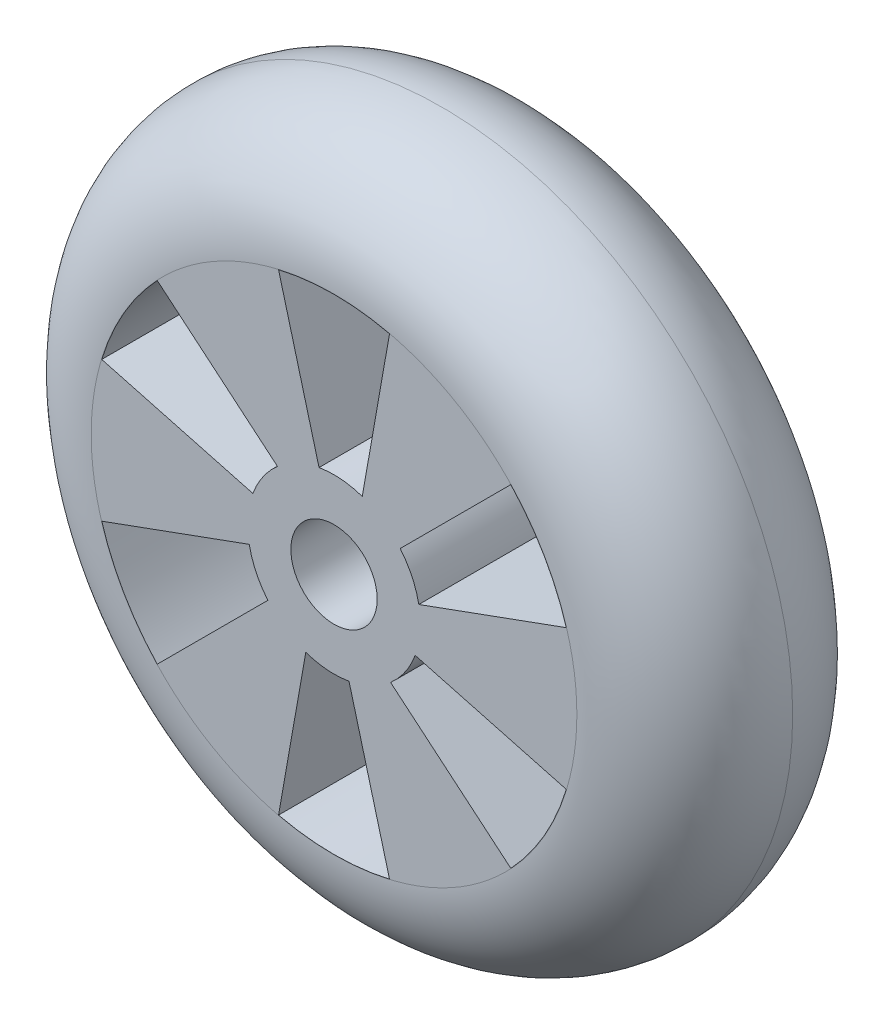
ISO-10303-21;
HEADER;
FILE_DESCRIPTION(('STEP AP214'),'2;1');
FILE_NAME('part.step','',(''),(''),'','','');
FILE_SCHEMA(('AUTOMOTIVE_DESIGN { 1 0 10303 214 1 1 1 1 }'));
ENDSEC;
DATA;
#1=APPLICATION_CONTEXT('core data for automotive mechanical design processes');
#2=APPLICATION_PROTOCOL_DEFINITION('international standard','automotive_design',2000,#1);
#3=PRODUCT_CONTEXT('',#1,'mechanical');
#4=PRODUCT('Part','Part','',(#3));
#5=PRODUCT_RELATED_PRODUCT_CATEGORY('part','',(#4));
#6=PRODUCT_DEFINITION_FORMATION('','',#4);
#7=PRODUCT_DEFINITION_CONTEXT('part definition',#1,'design');
#8=PRODUCT_DEFINITION('design','',#6,#7);
#9=PRODUCT_DEFINITION_SHAPE('','',#8);
#10=(LENGTH_UNIT() NAMED_UNIT(*) SI_UNIT(.MILLI.,.METRE.));
#11=(NAMED_UNIT(*) PLANE_ANGLE_UNIT() SI_UNIT($,.RADIAN.));
#12=(NAMED_UNIT(*) SI_UNIT($,.STERADIAN.) SOLID_ANGLE_UNIT());
#13=UNCERTAINTY_MEASURE_WITH_UNIT(LENGTH_MEASURE(1.E-05),#10,'distance_accuracy_value','');
#14=(GEOMETRIC_REPRESENTATION_CONTEXT(3) GLOBAL_UNCERTAINTY_ASSIGNED_CONTEXT((#13)) GLOBAL_UNIT_ASSIGNED_CONTEXT((#10,
#11,#12)) REPRESENTATION_CONTEXT('',''));
#15=CARTESIAN_POINT('',(0.,0.,0.));
#16=DIRECTION('',(0.,0.,1.));
#17=DIRECTION('',(1.,0.,0.));
#18=AXIS2_PLACEMENT_3D('',#15,#16,#17);
#19=CARTESIAN_POINT('',(0.,0.,20.));
#20=DIRECTION('',(0.,0.,1.));
#21=DIRECTION('',(1.,0.,0.));
#22=AXIS2_PLACEMENT_3D('',#19,#20,#21);
#23=PLANE('',#22);
#24=CARTESIAN_POINT('',(0.,0.,20.));
#25=DIRECTION('',(0.,0.,1.));
#26=DIRECTION('',(0.50000000000001,0.866025403784433,0.));
#27=AXIS2_PLACEMENT_3D('',#24,#25,#26);
#28=CIRCLE('',#27,22.4803729941762);
#29=CARTESIAN_POINT('',(-16.3814038721566,15.3953492046975,20.));
#30=VERTEX_POINT('',#29);
#31=CARTESIAN_POINT('',(-21.5234654474787,6.48903730059213,20.));
#32=VERTEX_POINT('',#31);
#33=EDGE_CURVE('E56',#30,#32,#28,.T.);
#34=ORIENTED_EDGE('',*,*,#33,.F.);
#35=DIRECTION('',(-0.76604444311897,0.642787609686549,0.));
#36=VECTOR('',#35,1.);
#37=CARTESIAN_POINT('',(-16.3814038721566,15.3953492046975,20.));
#38=LINE('',#37,#36);
#39=CARTESIAN_POINT('',(-5.23907942721059,6.04582887248546,20.));
#40=VERTEX_POINT('',#39);
#41=EDGE_CURVE('E370',#40,#30,#38,.T.);
#42=ORIENTED_EDGE('',*,*,#41,.F.);
#43=CARTESIAN_POINT('',(0.,0.,20.));
#44=DIRECTION('',(0.,0.,-1.));
#45=DIRECTION('',(0.50000000000001,0.866025403784433,0.));
#46=AXIS2_PLACEMENT_3D('',#43,#44,#45);
#47=CIRCLE('',#46,8.);
#48=CARTESIAN_POINT('',(-7.51754096628724,2.73616114660543,20.));
#49=VERTEX_POINT('',#48);
#50=EDGE_CURVE('E359',#49,#40,#47,.T.);
#51=ORIENTED_EDGE('',*,*,#50,.F.);
#52=DIRECTION('',(0.965925826289066,-0.258819045102531,0.));
#53=VECTOR('',#52,1.);
#54=CARTESIAN_POINT('',(-21.5234654474787,6.48903730059213,20.));
#55=LINE('',#54,#53);
#56=EDGE_CURVE('E345',#32,#49,#55,.T.);
#57=ORIENTED_EDGE('',*,*,#56,.F.);
#58=EDGE_LOOP('',(#34,#42,#51,#57));
#59=FACE_BOUND('',#58,.T.);
#60=CARTESIAN_POINT('',(0.,0.,20.));
#61=DIRECTION('',(0.,0.,1.));
#62=DIRECTION('',(-0.499999999999992,0.866025403784443,0.));
#63=AXIS2_PLACEMENT_3D('',#60,#61,#62);
#64=CIRCLE('',#63,22.4803729941762);
#65=CARTESIAN_POINT('',(-21.5234654474788,-6.48903730059168,20.));
#66=VERTEX_POINT('',#65);
#67=CARTESIAN_POINT('',(-16.3814038721569,-15.3953492046971,20.));
#68=VERTEX_POINT('',#67);
#69=EDGE_CURVE('E64',#66,#68,#64,.T.);
#70=ORIENTED_EDGE('',*,*,#69,.F.);
#71=DIRECTION('',(-0.939692620785912,-0.342020143325659,0.));
#72=VECTOR('',#71,1.);
#73=CARTESIAN_POINT('',(-21.5234654474788,-6.48903730059168,20.));
#74=LINE('',#73,#72);
#75=CARTESIAN_POINT('',(-7.85538110411112,-1.51426144016609,20.));
#76=VERTEX_POINT('',#75);
#77=EDGE_CURVE('E330',#76,#66,#74,.T.);
#78=ORIENTED_EDGE('',*,*,#77,.F.);
#79=CARTESIAN_POINT('',(0.,0.,20.));
#80=DIRECTION('',(0.,0.,-1.));
#81=DIRECTION('',(-0.499999999999992,0.866025403784443,0.));
#82=AXIS2_PLACEMENT_3D('',#79,#80,#81);
#83=CIRCLE('',#82,8.);
#84=CARTESIAN_POINT('',(-6.12835554495186,-5.14230087749226,20.));
#85=VERTEX_POINT('',#84);
#86=EDGE_CURVE('E319',#85,#76,#83,.T.);
#87=ORIENTED_EDGE('',*,*,#86,.F.);
#88=DIRECTION('',(0.707106781186553,0.707106781186542,0.));
#89=VECTOR('',#88,1.);
#90=CARTESIAN_POINT('',(-16.3814038721569,-15.3953492046971,20.));
#91=LINE('',#90,#89);
#92=EDGE_CURVE('E304',#68,#85,#91,.T.);
#93=ORIENTED_EDGE('',*,*,#92,.F.);
#94=EDGE_LOOP('',(#70,#78,#87,#93));
#95=FACE_BOUND('',#94,.T.);
#96=CARTESIAN_POINT('',(0.,0.,20.));
#97=DIRECTION('',(0.,0.,1.));
#98=DIRECTION('',(-1.,0.,0.));
#99=AXIS2_PLACEMENT_3D('',#96,#97,#98);
#100=CIRCLE('',#99,22.4803729941762);
#101=CARTESIAN_POINT('',(-5.14206157532201,-21.8843865052891,20.));
#102=VERTEX_POINT('',#101);
#103=CARTESIAN_POINT('',(5.14206157532202,-21.8843865052892,20.));
#104=VERTEX_POINT('',#103);
#105=EDGE_CURVE('E298',#102,#104,#100,.T.);
#106=ORIENTED_EDGE('',*,*,#105,.F.);
#107=DIRECTION('',(-0.173648177666931,-0.984807753012208,0.));
#108=VECTOR('',#107,1.);
#109=CARTESIAN_POINT('',(-5.14206157532201,-21.8843865052891,20.));
#110=LINE('',#109,#108);
#111=CARTESIAN_POINT('',(-2.61630167690045,-7.56009031265155,20.));
#112=VERTEX_POINT('',#111);
#113=EDGE_CURVE('E287',#112,#102,#110,.T.);
#114=ORIENTED_EDGE('',*,*,#113,.F.);
#115=CARTESIAN_POINT('',(0.,0.,20.));
#116=DIRECTION('',(0.,0.,-1.));
#117=DIRECTION('',(-1.,0.,0.));
#118=AXIS2_PLACEMENT_3D('',#115,#116,#117);
#119=CIRCLE('',#118,8.);
#120=CARTESIAN_POINT('',(1.38918542133545,-7.87846202409766,20.));
#121=VERTEX_POINT('',#120);
#122=EDGE_CURVE('E276',#121,#112,#119,.T.);
#123=ORIENTED_EDGE('',*,*,#122,.F.);
#124=DIRECTION('',(-0.258819045102522,0.965925826289068,0.));
#125=VECTOR('',#124,1.);
#126=CARTESIAN_POINT('',(5.14206157532201,-21.8843865052891,20.));
#127=LINE('',#126,#125);
#128=EDGE_CURVE('E260',#104,#121,#127,.T.);
#129=ORIENTED_EDGE('',*,*,#128,.F.);
#130=EDGE_LOOP('',(#106,#114,#123,#129));
#131=FACE_BOUND('',#130,.T.);
#132=CARTESIAN_POINT('',(0.,0.,20.));
#133=DIRECTION('',(0.,0.,1.));
#134=DIRECTION('',(-0.500000000000004,-0.866025403784436,0.));
#135=AXIS2_PLACEMENT_3D('',#132,#133,#134);
#136=CIRCLE('',#135,22.4803729941762);
#137=CARTESIAN_POINT('',(16.3814038721567,-15.3953492046973,20.));
#138=VERTEX_POINT('',#137);
#139=CARTESIAN_POINT('',(21.5234654474787,-6.48903730059198,20.));
#140=VERTEX_POINT('',#139);
#141=EDGE_CURVE('E252',#138,#140,#136,.T.);
#142=ORIENTED_EDGE('',*,*,#141,.F.);
#143=DIRECTION('',(0.766044443118975,-0.642787609686544,0.));
#144=VECTOR('',#143,1.);
#145=CARTESIAN_POINT('',(16.3814038721567,-15.3953492046973,20.));
#146=LINE('',#145,#144);
#147=CARTESIAN_POINT('',(5.23907942721063,-6.04582887248542,20.));
#148=VERTEX_POINT('',#147);
#149=EDGE_CURVE('E231',#148,#138,#146,.T.);
#150=ORIENTED_EDGE('',*,*,#149,.F.);
#151=CARTESIAN_POINT('',(0.,0.,20.));
#152=DIRECTION('',(0.,0.,-1.));
#153=DIRECTION('',(-0.500000000000004,-0.866025403784436,0.));
#154=AXIS2_PLACEMENT_3D('',#151,#152,#153);
#155=CIRCLE('',#154,8.);
#156=CARTESIAN_POINT('',(7.51754096628726,-2.73616114660538,20.));
#157=VERTEX_POINT('',#156);
#158=EDGE_CURVE('E223',#157,#148,#155,.T.);
#159=ORIENTED_EDGE('',*,*,#158,.F.);
#160=DIRECTION('',(-0.965925826289068,0.258819045102524,0.));
#161=VECTOR('',#160,1.);
#162=CARTESIAN_POINT('',(21.5234654474787,-6.48903730059198,20.));
#163=LINE('',#162,#161);
#164=EDGE_CURVE('E207',#140,#157,#163,.T.);
#165=ORIENTED_EDGE('',*,*,#164,.F.);
#166=EDGE_LOOP('',(#142,#150,#159,#165));
#167=FACE_BOUND('',#166,.T.);
#168=CARTESIAN_POINT('',(0.,0.,20.));
#169=DIRECTION('',(0.,0.,1.));
#170=DIRECTION('',(0.499999999999998,-0.86602540378444,0.));
#171=AXIS2_PLACEMENT_3D('',#168,#169,#170);
#172=CIRCLE('',#171,22.4803729941762);
#173=CARTESIAN_POINT('',(21.5234654474788,6.48903730059183,20.));
#174=VERTEX_POINT('',#173);
#175=CARTESIAN_POINT('',(16.3814038721568,15.3953492046972,20.));
#176=VERTEX_POINT('',#175);
#177=EDGE_CURVE('E421',#174,#176,#172,.T.);
#178=ORIENTED_EDGE('',*,*,#177,.F.);
#179=DIRECTION('',(0.93969262078591,0.342020143325666,0.));
#180=VECTOR('',#179,1.);
#181=CARTESIAN_POINT('',(21.5234654474788,6.48903730059183,20.));
#182=LINE('',#181,#180);
#183=CARTESIAN_POINT('',(7.85538110411112,1.51426144016614,20.));
#184=VERTEX_POINT('',#183);
#185=EDGE_CURVE('E410',#184,#174,#182,.T.);
#186=ORIENTED_EDGE('',*,*,#185,.F.);
#187=CARTESIAN_POINT('',(0.,0.,20.));
#188=DIRECTION('',(0.,0.,-1.));
#189=DIRECTION('',(0.499999999999998,-0.86602540378444,0.));
#190=AXIS2_PLACEMENT_3D('',#187,#188,#189);
#191=CIRCLE('',#190,8.);
#192=CARTESIAN_POINT('',(6.12835554495183,5.14230087749231,20.));
#193=VERTEX_POINT('',#192);
#194=EDGE_CURVE('E399',#193,#184,#191,.T.);
#195=ORIENTED_EDGE('',*,*,#194,.F.);
#196=DIRECTION('',(-0.707106781186549,-0.707106781186547,0.));
#197=VECTOR('',#196,1.);
#198=CARTESIAN_POINT('',(16.3814038721568,15.3953492046972,20.));
#199=LINE('',#198,#197);
#200=EDGE_CURVE('E259',#176,#193,#199,.T.);
#201=ORIENTED_EDGE('',*,*,#200,.F.);
#202=EDGE_LOOP('',(#178,#186,#195,#201));
#203=FACE_BOUND('',#202,.T.);
#204=CARTESIAN_POINT('',(0.,0.,20.));
#205=DIRECTION('',(0.,0.,1.));
#206=DIRECTION('',(1.,0.,0.));
#207=AXIS2_PLACEMENT_3D('',#204,#205,#206);
#208=CIRCLE('',#207,22.4803729941762);
#209=CARTESIAN_POINT('',(5.14206157532201,21.8843865052891,20.));
#210=VERTEX_POINT('',#209);
#211=CARTESIAN_POINT('',(-5.14206157532202,21.8843865052891,20.));
#212=VERTEX_POINT('',#211);
#213=EDGE_CURVE('E428',#210,#212,#208,.T.);
#214=ORIENTED_EDGE('',*,*,#213,.F.);
#215=DIRECTION('',(0.173648177666931,0.984807753012208,0.));
#216=VECTOR('',#215,1.);
#217=CARTESIAN_POINT('',(5.14206157532201,21.8843865052891,20.));
#218=LINE('',#217,#216);
#219=CARTESIAN_POINT('',(2.61630167690045,7.56009031265155,20.));
#220=VERTEX_POINT('',#219);
#221=EDGE_CURVE('E434',#220,#210,#218,.T.);
#222=ORIENTED_EDGE('',*,*,#221,.F.);
#223=CARTESIAN_POINT('',(0.,0.,20.));
#224=DIRECTION('',(0.,0.,-1.));
#225=DIRECTION('',(1.,0.,0.));
#226=AXIS2_PLACEMENT_3D('',#223,#224,#225);
#227=CIRCLE('',#226,8.);
#228=CARTESIAN_POINT('',(-1.38918542133545,7.87846202409766,20.));
#229=VERTEX_POINT('',#228);
#230=EDGE_CURVE('E453',#229,#220,#227,.T.);
#231=ORIENTED_EDGE('',*,*,#230,.F.);
#232=DIRECTION('',(0.258819045102522,-0.965925826289068,0.));
#233=VECTOR('',#232,1.);
#234=CARTESIAN_POINT('',(-5.14206157532201,21.8843865052891,20.));
#235=LINE('',#234,#233);
#236=EDGE_CURVE('E449',#212,#229,#235,.T.);
#237=ORIENTED_EDGE('',*,*,#236,.F.);
#238=EDGE_LOOP('',(#214,#222,#231,#237));
#239=FACE_BOUND('',#238,.T.);
#240=CARTESIAN_POINT('',(0.,0.,20.));
#241=DIRECTION('',(0.,0.,1.));
#242=DIRECTION('',(1.,0.,0.));
#243=AXIS2_PLACEMENT_3D('',#240,#241,#242);
#244=CIRCLE('',#243,22.5);
#245=CARTESIAN_POINT('',(22.5,0.,20.));
#246=VERTEX_POINT('',#245);
#247=EDGE_CURVE('E11',#246,#246,#244,.T.);
#248=ORIENTED_EDGE('',*,*,#247,.T.);
#249=EDGE_LOOP('',(#248));
#250=FACE_BOUND('',#249,.T.);
#251=CARTESIAN_POINT('',(0.,0.,20.));
#252=DIRECTION('',(0.,0.,1.));
#253=DIRECTION('',(1.,0.,0.));
#254=AXIS2_PLACEMENT_3D('',#251,#252,#253);
#255=CIRCLE('',#254,4.);
#256=CARTESIAN_POINT('',(4.,0.,20.));
#257=VERTEX_POINT('',#256);
#258=EDGE_CURVE('E472',#257,#257,#255,.T.);
#259=ORIENTED_EDGE('',*,*,#258,.F.);
#260=EDGE_LOOP('',(#259));
#261=FACE_BOUND('',#260,.T.);
#262=ADVANCED_FACE('F39',(#59,#95,#131,#167,#203,#239,#250,#261),#23,.T.);
#263=CARTESIAN_POINT('',(0.,0.,0.));
#264=DIRECTION('',(0.,0.,1.));
#265=DIRECTION('',(1.,0.,0.));
#266=AXIS2_PLACEMENT_3D('',#263,#264,#265);
#267=PLANE('',#266);
#268=DIRECTION('',(-0.76604444311897,0.642787609686549,0.));
#269=VECTOR('',#268,1.);
#270=CARTESIAN_POINT('',(-16.3814038721566,15.3953492046975,0.));
#271=LINE('',#270,#269);
#272=CARTESIAN_POINT('',(-5.23907942721059,6.04582887248546,0.));
#273=VERTEX_POINT('',#272);
#274=CARTESIAN_POINT('',(-16.3814038721566,15.3953492046975,0.));
#275=VERTEX_POINT('',#274);
#276=EDGE_CURVE('E376',#273,#275,#271,.T.);
#277=ORIENTED_EDGE('',*,*,#276,.T.);
#278=CARTESIAN_POINT('',(0.,0.,0.));
#279=DIRECTION('',(0.,0.,1.));
#280=DIRECTION('',(0.50000000000001,0.866025403784433,0.));
#281=AXIS2_PLACEMENT_3D('',#278,#279,#280);
#282=CIRCLE('',#281,22.4803729941762);
#283=CARTESIAN_POINT('',(-21.5234654474787,6.48903730059213,0.));
#284=VERTEX_POINT('',#283);
#285=EDGE_CURVE('E308',#275,#284,#282,.T.);
#286=ORIENTED_EDGE('',*,*,#285,.T.);
#287=DIRECTION('',(0.965925826289066,-0.258819045102531,0.));
#288=VECTOR('',#287,1.);
#289=CARTESIAN_POINT('',(-21.5234654474787,6.48903730059213,0.));
#290=LINE('',#289,#288);
#291=CARTESIAN_POINT('',(-7.51754096628724,2.73616114660543,0.));
#292=VERTEX_POINT('',#291);
#293=EDGE_CURVE('E348',#284,#292,#290,.T.);
#294=ORIENTED_EDGE('',*,*,#293,.T.);
#295=CARTESIAN_POINT('',(0.,0.,0.));
#296=DIRECTION('',(0.,0.,-1.));
#297=DIRECTION('',(0.50000000000001,0.866025403784433,0.));
#298=AXIS2_PLACEMENT_3D('',#295,#296,#297);
#299=CIRCLE('',#298,8.);
#300=EDGE_CURVE('E366',#292,#273,#299,.T.);
#301=ORIENTED_EDGE('',*,*,#300,.T.);
#302=EDGE_LOOP('',(#277,#286,#294,#301));
#303=FACE_BOUND('',#302,.T.);
#304=DIRECTION('',(-0.939692620785912,-0.342020143325659,0.));
#305=VECTOR('',#304,1.);
#306=CARTESIAN_POINT('',(-21.5234654474788,-6.48903730059168,0.));
#307=LINE('',#306,#305);
#308=CARTESIAN_POINT('',(-7.85538110411112,-1.51426144016609,0.));
#309=VERTEX_POINT('',#308);
#310=CARTESIAN_POINT('',(-21.5234654474788,-6.48903730059168,0.));
#311=VERTEX_POINT('',#310);
#312=EDGE_CURVE('E336',#309,#311,#307,.T.);
#313=ORIENTED_EDGE('',*,*,#312,.T.);
#314=CARTESIAN_POINT('',(0.,0.,0.));
#315=DIRECTION('',(0.,0.,1.));
#316=DIRECTION('',(-0.499999999999992,0.866025403784443,0.));
#317=AXIS2_PLACEMENT_3D('',#314,#315,#316);
#318=CIRCLE('',#317,22.4803729941762);
#319=CARTESIAN_POINT('',(-16.3814038721569,-15.3953492046971,0.));
#320=VERTEX_POINT('',#319);
#321=EDGE_CURVE('E264',#311,#320,#318,.T.);
#322=ORIENTED_EDGE('',*,*,#321,.T.);
#323=DIRECTION('',(0.707106781186553,0.707106781186542,0.));
#324=VECTOR('',#323,1.);
#325=CARTESIAN_POINT('',(-16.3814038721569,-15.3953492046971,0.));
#326=LINE('',#325,#324);
#327=CARTESIAN_POINT('',(-6.12835554495187,-5.14230087749227,0.));
#328=VERTEX_POINT('',#327);
#329=EDGE_CURVE('E307',#320,#328,#326,.T.);
#330=ORIENTED_EDGE('',*,*,#329,.T.);
#331=CARTESIAN_POINT('',(0.,0.,0.));
#332=DIRECTION('',(0.,0.,-1.));
#333=DIRECTION('',(-0.499999999999992,0.866025403784443,0.));
#334=AXIS2_PLACEMENT_3D('',#331,#332,#333);
#335=CIRCLE('',#334,8.);
#336=EDGE_CURVE('E326',#328,#309,#335,.T.);
#337=ORIENTED_EDGE('',*,*,#336,.T.);
#338=EDGE_LOOP('',(#313,#322,#330,#337));
#339=FACE_BOUND('',#338,.T.);
#340=DIRECTION('',(-0.173648177666931,-0.984807753012208,0.));
#341=VECTOR('',#340,1.);
#342=CARTESIAN_POINT('',(-5.14206157532201,-21.8843865052891,0.));
#343=LINE('',#342,#341);
#344=CARTESIAN_POINT('',(-2.61630167690045,-7.56009031265155,0.));
#345=VERTEX_POINT('',#344);
#346=CARTESIAN_POINT('',(-5.14206157532201,-21.8843865052891,0.));
#347=VERTEX_POINT('',#346);
#348=EDGE_CURVE('E294',#345,#347,#343,.T.);
#349=ORIENTED_EDGE('',*,*,#348,.T.);
#350=CARTESIAN_POINT('',(0.,0.,0.));
#351=DIRECTION('',(0.,0.,1.));
#352=DIRECTION('',(-1.,0.,0.));
#353=AXIS2_PLACEMENT_3D('',#350,#351,#352);
#354=CIRCLE('',#353,22.4803729941762);
#355=CARTESIAN_POINT('',(5.14206157532201,-21.8843865052891,0.));
#356=VERTEX_POINT('',#355);
#357=EDGE_CURVE('E219',#347,#356,#354,.T.);
#358=ORIENTED_EDGE('',*,*,#357,.T.);
#359=DIRECTION('',(-0.258819045102522,0.965925826289068,0.));
#360=VECTOR('',#359,1.);
#361=CARTESIAN_POINT('',(5.14206157532201,-21.8843865052891,0.));
#362=LINE('',#361,#360);
#363=CARTESIAN_POINT('',(1.38918542133545,-7.87846202409766,0.));
#364=VERTEX_POINT('',#363);
#365=EDGE_CURVE('E263',#356,#364,#362,.T.);
#366=ORIENTED_EDGE('',*,*,#365,.T.);
#367=CARTESIAN_POINT('',(0.,0.,0.));
#368=DIRECTION('',(0.,0.,-1.));
#369=DIRECTION('',(-1.,0.,0.));
#370=AXIS2_PLACEMENT_3D('',#367,#368,#369);
#371=CIRCLE('',#370,8.);
#372=EDGE_CURVE('E283',#364,#345,#371,.T.);
#373=ORIENTED_EDGE('',*,*,#372,.T.);
#374=EDGE_LOOP('',(#349,#358,#366,#373));
#375=FACE_BOUND('',#374,.T.);
#376=DIRECTION('',(0.766044443118975,-0.642787609686544,0.));
#377=VECTOR('',#376,1.);
#378=CARTESIAN_POINT('',(16.3814038721567,-15.3953492046973,0.));
#379=LINE('',#378,#377);
#380=CARTESIAN_POINT('',(5.23907942721063,-6.04582887248542,0.));
#381=VERTEX_POINT('',#380);
#382=CARTESIAN_POINT('',(16.3814038721567,-15.3953492046973,0.));
#383=VERTEX_POINT('',#382);
#384=EDGE_CURVE('E248',#381,#383,#379,.T.);
#385=ORIENTED_EDGE('',*,*,#384,.T.);
#386=CARTESIAN_POINT('',(0.,0.,0.));
#387=DIRECTION('',(0.,0.,1.));
#388=DIRECTION('',(-0.500000000000004,-0.866025403784436,0.));
#389=AXIS2_PLACEMENT_3D('',#386,#387,#388);
#390=CIRCLE('',#389,22.4803729941762);
#391=CARTESIAN_POINT('',(21.5234654474787,-6.48903730059198,0.));
#392=VERTEX_POINT('',#391);
#393=EDGE_CURVE('E255',#383,#392,#390,.T.);
#394=ORIENTED_EDGE('',*,*,#393,.T.);
#395=DIRECTION('',(-0.965925826289068,0.258819045102524,0.));
#396=VECTOR('',#395,1.);
#397=CARTESIAN_POINT('',(21.5234654474787,-6.48903730059198,0.));
#398=LINE('',#397,#396);
#399=CARTESIAN_POINT('',(7.51754096628726,-2.73616114660538,0.));
#400=VERTEX_POINT('',#399);
#401=EDGE_CURVE('E218',#392,#400,#398,.T.);
#402=ORIENTED_EDGE('',*,*,#401,.T.);
#403=CARTESIAN_POINT('',(0.,0.,0.));
#404=DIRECTION('',(0.,0.,-1.));
#405=DIRECTION('',(-0.500000000000004,-0.866025403784436,0.));
#406=AXIS2_PLACEMENT_3D('',#403,#404,#405);
#407=CIRCLE('',#406,8.);
#408=EDGE_CURVE('E226',#400,#381,#407,.T.);
#409=ORIENTED_EDGE('',*,*,#408,.T.);
#410=EDGE_LOOP('',(#385,#394,#402,#409));
#411=FACE_BOUND('',#410,.T.);
#412=DIRECTION('',(0.93969262078591,0.342020143325666,0.));
#413=VECTOR('',#412,1.);
#414=CARTESIAN_POINT('',(21.5234654474788,6.48903730059183,0.));
#415=LINE('',#414,#413);
#416=CARTESIAN_POINT('',(7.85538110411112,1.51426144016614,0.));
#417=VERTEX_POINT('',#416);
#418=CARTESIAN_POINT('',(21.5234654474788,6.48903730059183,0.));
#419=VERTEX_POINT('',#418);
#420=EDGE_CURVE('E417',#417,#419,#415,.T.);
#421=ORIENTED_EDGE('',*,*,#420,.T.);
#422=CARTESIAN_POINT('',(0.,0.,0.));
#423=DIRECTION('',(0.,0.,1.));
#424=DIRECTION('',(0.499999999999998,-0.86602540378444,0.));
#425=AXIS2_PLACEMENT_3D('',#422,#423,#424);
#426=CIRCLE('',#425,22.4803729941762);
#427=CARTESIAN_POINT('',(16.3814038721568,15.3953492046972,0.));
#428=VERTEX_POINT('',#427);
#429=EDGE_CURVE('E424',#419,#428,#426,.T.);
#430=ORIENTED_EDGE('',*,*,#429,.T.);
#431=DIRECTION('',(-0.707106781186549,-0.707106781186547,0.));
#432=VECTOR('',#431,1.);
#433=CARTESIAN_POINT('',(16.3814038721568,15.3953492046972,0.));
#434=LINE('',#433,#432);
#435=CARTESIAN_POINT('',(6.12835554495183,5.14230087749231,0.));
#436=VERTEX_POINT('',#435);
#437=EDGE_CURVE('E387',#428,#436,#434,.T.);
#438=ORIENTED_EDGE('',*,*,#437,.T.);
#439=CARTESIAN_POINT('',(0.,0.,0.));
#440=DIRECTION('',(0.,0.,-1.));
#441=DIRECTION('',(0.499999999999998,-0.86602540378444,0.));
#442=AXIS2_PLACEMENT_3D('',#439,#440,#441);
#443=CIRCLE('',#442,8.);
#444=EDGE_CURVE('E406',#436,#417,#443,.T.);
#445=ORIENTED_EDGE('',*,*,#444,.T.);
#446=EDGE_LOOP('',(#421,#430,#438,#445));
#447=FACE_BOUND('',#446,.T.);
#448=DIRECTION('',(0.173648177666931,0.984807753012208,0.));
#449=VECTOR('',#448,1.);
#450=CARTESIAN_POINT('',(5.14206157532201,21.8843865052891,0.));
#451=LINE('',#450,#449);
#452=CARTESIAN_POINT('',(2.61630167690045,7.56009031265155,0.));
#453=VERTEX_POINT('',#452);
#454=CARTESIAN_POINT('',(5.14206157532201,21.8843865052891,0.));
#455=VERTEX_POINT('',#454);
#456=EDGE_CURVE('E442',#453,#455,#451,.T.);
#457=ORIENTED_EDGE('',*,*,#456,.T.);
#458=CARTESIAN_POINT('',(0.,0.,0.));
#459=DIRECTION('',(0.,0.,1.));
#460=DIRECTION('',(1.,0.,0.));
#461=AXIS2_PLACEMENT_3D('',#458,#459,#460);
#462=CIRCLE('',#461,22.4803729941762);
#463=CARTESIAN_POINT('',(-5.14206157532201,21.8843865052891,0.));
#464=VERTEX_POINT('',#463);
#465=EDGE_CURVE('E429',#455,#464,#462,.T.);
#466=ORIENTED_EDGE('',*,*,#465,.T.);
#467=DIRECTION('',(0.258819045102522,-0.965925826289068,0.));
#468=VECTOR('',#467,1.);
#469=CARTESIAN_POINT('',(-5.14206157532201,21.8843865052891,0.));
#470=LINE('',#469,#468);
#471=CARTESIAN_POINT('',(-1.38918542133545,7.87846202409766,0.));
#472=VERTEX_POINT('',#471);
#473=EDGE_CURVE('E433',#464,#472,#470,.T.);
#474=ORIENTED_EDGE('',*,*,#473,.T.);
#475=CARTESIAN_POINT('',(0.,0.,0.));
#476=DIRECTION('',(0.,0.,-1.));
#477=DIRECTION('',(1.,0.,0.));
#478=AXIS2_PLACEMENT_3D('',#475,#476,#477);
#479=CIRCLE('',#478,8.);
#480=EDGE_CURVE('E438',#472,#453,#479,.T.);
#481=ORIENTED_EDGE('',*,*,#480,.T.);
#482=EDGE_LOOP('',(#457,#466,#474,#481));
#483=FACE_BOUND('',#482,.T.);
#484=CARTESIAN_POINT('',(0.,0.,0.));
#485=DIRECTION('',(0.,0.,1.));
#486=DIRECTION('',(1.,0.,0.));
#487=AXIS2_PLACEMENT_3D('',#484,#485,#486);
#488=CIRCLE('',#487,22.5);
#489=CARTESIAN_POINT('',(22.5,0.,0.));
#490=VERTEX_POINT('',#489);
#491=EDGE_CURVE('E49',#490,#490,#488,.F.);
#492=ORIENTED_EDGE('',*,*,#491,.T.);
#493=EDGE_LOOP('',(#492));
#494=FACE_BOUND('',#493,.T.);
#495=CARTESIAN_POINT('',(0.,0.,0.));
#496=DIRECTION('',(0.,0.,1.));
#497=DIRECTION('',(1.,0.,0.));
#498=AXIS2_PLACEMENT_3D('',#495,#496,#497);
#499=CIRCLE('',#498,4.);
#500=CARTESIAN_POINT('',(4.,0.,0.));
#501=VERTEX_POINT('',#500);
#502=EDGE_CURVE('E476',#501,#501,#499,.T.);
#503=ORIENTED_EDGE('',*,*,#502,.T.);
#504=EDGE_LOOP('',(#503));
#505=FACE_BOUND('',#504,.T.);
#506=ADVANCED_FACE('F484',(#303,#339,#375,#411,#447,#483,#494,#505),#267,.F.);
#507=CARTESIAN_POINT('',(0.,0.,20.));
#508=DIRECTION('',(0.,0.,-1.));
#509=DIRECTION('',(-1.,0.,0.));
#510=AXIS2_PLACEMENT_3D('',#507,#508,#509);
#511=CYLINDRICAL_SURFACE('',#510,4.);
#512=ORIENTED_EDGE('',*,*,#258,.T.);
#513=EDGE_LOOP('',(#512));
#514=FACE_BOUND('',#513,.T.);
#515=ORIENTED_EDGE('',*,*,#502,.F.);
#516=EDGE_LOOP('',(#515));
#517=FACE_BOUND('',#516,.T.);
#518=ADVANCED_FACE('F496',(#514,#517),#511,.F.);
#519=CARTESIAN_POINT('',(0.,0.,10.));
#520=DIRECTION('',(0.,0.,1.));
#521=DIRECTION('',(1.,0.,0.));
#522=AXIS2_PLACEMENT_3D('',#519,#520,#521);
#523=TOROIDAL_SURFACE('',#522,22.5,10.);
#524=ORIENTED_EDGE('',*,*,#247,.F.);
#525=EDGE_LOOP('',(#524));
#526=FACE_BOUND('',#525,.T.);
#527=CARTESIAN_POINT('',(0.,0.,10.));
#528=DIRECTION('',(0.,0.,1.));
#529=DIRECTION('',(1.,0.,0.));
#530=AXIS2_PLACEMENT_3D('',#527,#528,#529);
#531=CIRCLE('',#530,32.5);
#532=CARTESIAN_POINT('',(32.5,0.,10.));
#533=VERTEX_POINT('',#532);
#534=EDGE_CURVE('E43',#533,#533,#531,.F.);
#535=ORIENTED_EDGE('',*,*,#534,.F.);
#536=EDGE_LOOP('',(#535));
#537=FACE_BOUND('',#536,.T.);
#538=ADVANCED_FACE('F41',(#526,#537),#523,.T.);
#539=CARTESIAN_POINT('',(0.,0.,10.));
#540=DIRECTION('',(0.,0.,1.));
#541=DIRECTION('',(1.,0.,0.));
#542=AXIS2_PLACEMENT_3D('',#539,#540,#541);
#543=TOROIDAL_SURFACE('',#542,22.5,10.);
#544=ORIENTED_EDGE('',*,*,#491,.F.);
#545=EDGE_LOOP('',(#544));
#546=FACE_BOUND('',#545,.T.);
#547=ORIENTED_EDGE('',*,*,#534,.T.);
#548=EDGE_LOOP('',(#547));
#549=FACE_BOUND('',#548,.T.);
#550=ADVANCED_FACE('F487',(#546,#549),#543,.T.);
#551=CARTESIAN_POINT('',(0.,0.,0.));
#552=DIRECTION('',(0.,0.,1.));
#553=DIRECTION('',(1.,0.,0.));
#554=AXIS2_PLACEMENT_3D('',#551,#552,#553);
#555=CYLINDRICAL_SURFACE('',#554,22.4803729941762);
#556=ORIENTED_EDGE('',*,*,#213,.T.);
#557=DIRECTION('',(0.,0.,1.));
#558=VECTOR('',#557,1.);
#559=CARTESIAN_POINT('',(-5.14206157532201,21.8843865052891,0.));
#560=LINE('',#559,#558);
#561=EDGE_CURVE('E446',#464,#212,#560,.T.);
#562=ORIENTED_EDGE('',*,*,#561,.F.);
#563=ORIENTED_EDGE('',*,*,#465,.F.);
#564=DIRECTION('',(0.,0.,1.));
#565=VECTOR('',#564,1.);
#566=CARTESIAN_POINT('',(5.14206157532201,21.8843865052891,0.));
#567=LINE('',#566,#565);
#568=EDGE_CURVE('E460',#455,#210,#567,.T.);
#569=ORIENTED_EDGE('',*,*,#568,.T.);
#570=EDGE_LOOP('',(#556,#562,#563,#569));
#571=FACE_BOUND('',#570,.T.);
#572=ADVANCED_FACE('F490',(#571),#555,.F.);
#573=CARTESIAN_POINT('',(5.14206157532201,21.8843865052891,0.));
#574=DIRECTION('',(0.984807753012208,-0.173648177666931,0.));
#575=DIRECTION('',(0.173648177666931,0.984807753012208,0.));
#576=AXIS2_PLACEMENT_3D('',#573,#574,#575);
#577=PLANE('',#576);
#578=ORIENTED_EDGE('',*,*,#221,.T.);
#579=ORIENTED_EDGE('',*,*,#568,.F.);
#580=ORIENTED_EDGE('',*,*,#456,.F.);
#581=DIRECTION('',(0.,0.,1.));
#582=VECTOR('',#581,1.);
#583=CARTESIAN_POINT('',(2.61630167690045,7.56009031265155,0.));
#584=LINE('',#583,#582);
#585=EDGE_CURVE('E463',#453,#220,#584,.T.);
#586=ORIENTED_EDGE('',*,*,#585,.T.);
#587=EDGE_LOOP('',(#578,#579,#580,#586));
#588=FACE_BOUND('',#587,.T.);
#589=ADVANCED_FACE('F516',(#588),#577,.F.);
#590=CARTESIAN_POINT('',(0.,0.,0.));
#591=DIRECTION('',(0.,0.,1.));
#592=DIRECTION('',(1.,0.,0.));
#593=AXIS2_PLACEMENT_3D('',#590,#591,#592);
#594=CYLINDRICAL_SURFACE('',#593,8.);
#595=ORIENTED_EDGE('',*,*,#230,.T.);
#596=ORIENTED_EDGE('',*,*,#585,.F.);
#597=ORIENTED_EDGE('',*,*,#480,.F.);
#598=DIRECTION('',(0.,0.,1.));
#599=VECTOR('',#598,1.);
#600=CARTESIAN_POINT('',(-1.38918542133545,7.87846202409766,0.));
#601=LINE('',#600,#599);
#602=EDGE_CURVE('E466',#472,#229,#601,.T.);
#603=ORIENTED_EDGE('',*,*,#602,.T.);
#604=EDGE_LOOP('',(#595,#596,#597,#603));
#605=FACE_BOUND('',#604,.T.);
#606=ADVANCED_FACE('F522',(#605),#594,.T.);
#607=CARTESIAN_POINT('',(-5.14206157532201,21.8843865052891,0.));
#608=DIRECTION('',(-0.965925826289068,-0.258819045102522,0.));
#609=DIRECTION('',(0.258819045102522,-0.965925826289068,0.));
#610=AXIS2_PLACEMENT_3D('',#607,#608,#609);
#611=PLANE('',#610);
#612=ORIENTED_EDGE('',*,*,#236,.T.);
#613=ORIENTED_EDGE('',*,*,#602,.F.);
#614=ORIENTED_EDGE('',*,*,#473,.F.);
#615=ORIENTED_EDGE('',*,*,#561,.T.);
#616=EDGE_LOOP('',(#612,#613,#614,#615));
#617=FACE_BOUND('',#616,.T.);
#618=ADVANCED_FACE('F518',(#617),#611,.F.);
#619=CARTESIAN_POINT('',(0.,0.,0.));
#620=DIRECTION('',(0.,0.,1.));
#621=DIRECTION('',(0.499999999999998,-0.86602540378444,0.));
#622=AXIS2_PLACEMENT_3D('',#619,#620,#621);
#623=CYLINDRICAL_SURFACE('',#622,22.4803729941762);
#624=ORIENTED_EDGE('',*,*,#177,.T.);
#625=DIRECTION('',(0.,0.,1.));
#626=VECTOR('',#625,1.);
#627=CARTESIAN_POINT('',(16.3814038721568,15.3953492046972,0.));
#628=LINE('',#627,#626);
#629=EDGE_CURVE('E395',#428,#176,#628,.T.);
#630=ORIENTED_EDGE('',*,*,#629,.F.);
#631=ORIENTED_EDGE('',*,*,#429,.F.);
#632=DIRECTION('',(0.,0.,1.));
#633=VECTOR('',#632,1.);
#634=CARTESIAN_POINT('',(21.5234654474788,6.48903730059183,0.));
#635=LINE('',#634,#633);
#636=EDGE_CURVE('E413',#419,#174,#635,.T.);
#637=ORIENTED_EDGE('',*,*,#636,.T.);
#638=EDGE_LOOP('',(#624,#630,#631,#637));
#639=FACE_BOUND('',#638,.T.);
#640=ADVANCED_FACE('F521',(#639),#623,.F.);
#641=CARTESIAN_POINT('',(21.5234654474788,6.48903730059183,0.));
#642=DIRECTION('',(0.342020143325666,-0.93969262078591,0.));
#643=DIRECTION('',(0.93969262078591,0.342020143325666,0.));
#644=AXIS2_PLACEMENT_3D('',#641,#642,#643);
#645=PLANE('',#644);
#646=ORIENTED_EDGE('',*,*,#185,.T.);
#647=ORIENTED_EDGE('',*,*,#636,.F.);
#648=ORIENTED_EDGE('',*,*,#420,.F.);
#649=DIRECTION('',(0.,0.,1.));
#650=VECTOR('',#649,1.);
#651=CARTESIAN_POINT('',(7.85538110411112,1.51426144016614,0.));
#652=LINE('',#651,#650);
#653=EDGE_CURVE('E402',#417,#184,#652,.T.);
#654=ORIENTED_EDGE('',*,*,#653,.T.);
#655=EDGE_LOOP('',(#646,#647,#648,#654));
#656=FACE_BOUND('',#655,.T.);
#657=ADVANCED_FACE('F532',(#656),#645,.F.);
#658=CARTESIAN_POINT('',(0.,0.,0.));
#659=DIRECTION('',(0.,0.,1.));
#660=DIRECTION('',(0.499999999999998,-0.86602540378444,0.));
#661=AXIS2_PLACEMENT_3D('',#658,#659,#660);
#662=CYLINDRICAL_SURFACE('',#661,8.);
#663=ORIENTED_EDGE('',*,*,#194,.T.);
#664=ORIENTED_EDGE('',*,*,#653,.F.);
#665=ORIENTED_EDGE('',*,*,#444,.F.);
#666=DIRECTION('',(0.,0.,1.));
#667=VECTOR('',#666,1.);
#668=CARTESIAN_POINT('',(6.12835554495183,5.14230087749231,0.));
#669=LINE('',#668,#667);
#670=EDGE_CURVE('E391',#436,#193,#669,.T.);
#671=ORIENTED_EDGE('',*,*,#670,.T.);
#672=EDGE_LOOP('',(#663,#664,#665,#671));
#673=FACE_BOUND('',#672,.T.);
#674=ADVANCED_FACE('F536',(#673),#662,.T.);
#675=CARTESIAN_POINT('',(16.3814038721568,15.3953492046972,0.));
#676=DIRECTION('',(-0.707106781186547,0.707106781186549,0.));
#677=DIRECTION('',(-0.707106781186549,-0.707106781186547,0.));
#678=AXIS2_PLACEMENT_3D('',#675,#676,#677);
#679=PLANE('',#678);
#680=ORIENTED_EDGE('',*,*,#200,.T.);
#681=ORIENTED_EDGE('',*,*,#670,.F.);
#682=ORIENTED_EDGE('',*,*,#437,.F.);
#683=ORIENTED_EDGE('',*,*,#629,.T.);
#684=EDGE_LOOP('',(#680,#681,#682,#683));
#685=FACE_BOUND('',#684,.T.);
#686=ADVANCED_FACE('F540',(#685),#679,.F.);
#687=CARTESIAN_POINT('',(0.,0.,0.));
#688=DIRECTION('',(0.,0.,1.));
#689=DIRECTION('',(-0.500000000000004,-0.866025403784436,0.));
#690=AXIS2_PLACEMENT_3D('',#687,#688,#689);
#691=CYLINDRICAL_SURFACE('',#690,22.4803729941762);
#692=ORIENTED_EDGE('',*,*,#141,.T.);
#693=DIRECTION('',(0.,0.,1.));
#694=VECTOR('',#693,1.);
#695=CARTESIAN_POINT('',(21.5234654474787,-6.48903730059198,0.));
#696=LINE('',#695,#694);
#697=EDGE_CURVE('E213',#392,#140,#696,.T.);
#698=ORIENTED_EDGE('',*,*,#697,.F.);
#699=ORIENTED_EDGE('',*,*,#393,.F.);
#700=DIRECTION('',(0.,0.,1.));
#701=VECTOR('',#700,1.);
#702=CARTESIAN_POINT('',(16.3814038721567,-15.3953492046973,0.));
#703=LINE('',#702,#701);
#704=EDGE_CURVE('E244',#383,#138,#703,.T.);
#705=ORIENTED_EDGE('',*,*,#704,.T.);
#706=EDGE_LOOP('',(#692,#698,#699,#705));
#707=FACE_BOUND('',#706,.T.);
#708=ADVANCED_FACE('F544',(#707),#691,.F.);
#709=CARTESIAN_POINT('',(16.3814038721567,-15.3953492046973,0.));
#710=DIRECTION('',(-0.642787609686544,-0.766044443118975,0.));
#711=DIRECTION('',(0.766044443118975,-0.642787609686544,0.));
#712=AXIS2_PLACEMENT_3D('',#709,#710,#711);
#713=PLANE('',#712);
#714=ORIENTED_EDGE('',*,*,#149,.T.);
#715=ORIENTED_EDGE('',*,*,#704,.F.);
#716=ORIENTED_EDGE('',*,*,#384,.F.);
#717=DIRECTION('',(0.,0.,1.));
#718=VECTOR('',#717,1.);
#719=CARTESIAN_POINT('',(5.23907942721063,-6.04582887248542,0.));
#720=LINE('',#719,#718);
#721=EDGE_CURVE('E233',#381,#148,#720,.T.);
#722=ORIENTED_EDGE('',*,*,#721,.T.);
#723=EDGE_LOOP('',(#714,#715,#716,#722));
#724=FACE_BOUND('',#723,.T.);
#725=ADVANCED_FACE('F594',(#724),#713,.F.);
#726=CARTESIAN_POINT('',(0.,0.,0.));
#727=DIRECTION('',(0.,0.,1.));
#728=DIRECTION('',(-0.500000000000004,-0.866025403784436,0.));
#729=AXIS2_PLACEMENT_3D('',#726,#727,#728);
#730=CYLINDRICAL_SURFACE('',#729,8.);
#731=ORIENTED_EDGE('',*,*,#158,.T.);
#732=ORIENTED_EDGE('',*,*,#721,.F.);
#733=ORIENTED_EDGE('',*,*,#408,.F.);
#734=DIRECTION('',(0.,0.,1.));
#735=VECTOR('',#734,1.);
#736=CARTESIAN_POINT('',(7.51754096628726,-2.73616114660538,0.));
#737=LINE('',#736,#735);
#738=EDGE_CURVE('E210',#400,#157,#737,.T.);
#739=ORIENTED_EDGE('',*,*,#738,.T.);
#740=EDGE_LOOP('',(#731,#732,#733,#739));
#741=FACE_BOUND('',#740,.T.);
#742=ADVANCED_FACE('F222',(#741),#730,.T.);
#743=CARTESIAN_POINT('',(21.5234654474787,-6.48903730059198,0.));
#744=DIRECTION('',(0.258819045102524,0.965925826289068,0.));
#745=DIRECTION('',(-0.965925826289068,0.258819045102524,0.));
#746=AXIS2_PLACEMENT_3D('',#743,#744,#745);
#747=PLANE('',#746);
#748=ORIENTED_EDGE('',*,*,#164,.T.);
#749=ORIENTED_EDGE('',*,*,#738,.F.);
#750=ORIENTED_EDGE('',*,*,#401,.F.);
#751=ORIENTED_EDGE('',*,*,#697,.T.);
#752=EDGE_LOOP('',(#748,#749,#750,#751));
#753=FACE_BOUND('',#752,.T.);
#754=ADVANCED_FACE('F209',(#753),#747,.F.);
#755=CARTESIAN_POINT('',(0.,0.,0.));
#756=DIRECTION('',(0.,0.,1.));
#757=DIRECTION('',(-1.,0.,0.));
#758=AXIS2_PLACEMENT_3D('',#755,#756,#757);
#759=CYLINDRICAL_SURFACE('',#758,22.4803729941762);
#760=ORIENTED_EDGE('',*,*,#105,.T.);
#761=DIRECTION('',(0.,0.,1.));
#762=VECTOR('',#761,1.);
#763=CARTESIAN_POINT('',(5.14206157532201,-21.8843865052891,0.));
#764=LINE('',#763,#762);
#765=EDGE_CURVE('E272',#356,#104,#764,.T.);
#766=ORIENTED_EDGE('',*,*,#765,.F.);
#767=ORIENTED_EDGE('',*,*,#357,.F.);
#768=DIRECTION('',(0.,0.,1.));
#769=VECTOR('',#768,1.);
#770=CARTESIAN_POINT('',(-5.14206157532201,-21.8843865052891,0.));
#771=LINE('',#770,#769);
#772=EDGE_CURVE('E290',#347,#102,#771,.T.);
#773=ORIENTED_EDGE('',*,*,#772,.T.);
#774=EDGE_LOOP('',(#760,#766,#767,#773));
#775=FACE_BOUND('',#774,.T.);
#776=ADVANCED_FACE('F577',(#775),#759,.F.);
#777=CARTESIAN_POINT('',(-5.14206157532201,-21.8843865052891,0.));
#778=DIRECTION('',(-0.984807753012208,0.173648177666931,0.));
#779=DIRECTION('',(-0.173648177666931,-0.984807753012208,0.));
#780=AXIS2_PLACEMENT_3D('',#777,#778,#779);
#781=PLANE('',#780);
#782=ORIENTED_EDGE('',*,*,#113,.T.);
#783=ORIENTED_EDGE('',*,*,#772,.F.);
#784=ORIENTED_EDGE('',*,*,#348,.F.);
#785=DIRECTION('',(0.,0.,1.));
#786=VECTOR('',#785,1.);
#787=CARTESIAN_POINT('',(-2.61630167690045,-7.56009031265155,0.));
#788=LINE('',#787,#786);
#789=EDGE_CURVE('E279',#345,#112,#788,.T.);
#790=ORIENTED_EDGE('',*,*,#789,.T.);
#791=EDGE_LOOP('',(#782,#783,#784,#790));
#792=FACE_BOUND('',#791,.T.);
#793=ADVANCED_FACE('F580',(#792),#781,.F.);
#794=CARTESIAN_POINT('',(0.,0.,0.));
#795=DIRECTION('',(0.,0.,1.));
#796=DIRECTION('',(-1.,0.,0.));
#797=AXIS2_PLACEMENT_3D('',#794,#795,#796);
#798=CYLINDRICAL_SURFACE('',#797,8.);
#799=ORIENTED_EDGE('',*,*,#122,.T.);
#800=ORIENTED_EDGE('',*,*,#789,.F.);
#801=ORIENTED_EDGE('',*,*,#372,.F.);
#802=DIRECTION('',(0.,0.,1.));
#803=VECTOR('',#802,1.);
#804=CARTESIAN_POINT('',(1.38918542133545,-7.87846202409766,0.));
#805=LINE('',#804,#803);
#806=EDGE_CURVE('E268',#364,#121,#805,.T.);
#807=ORIENTED_EDGE('',*,*,#806,.T.);
#808=EDGE_LOOP('',(#799,#800,#801,#807));
#809=FACE_BOUND('',#808,.T.);
#810=ADVANCED_FACE('F584',(#809),#798,.T.);
#811=CARTESIAN_POINT('',(5.14206157532201,-21.8843865052891,0.));
#812=DIRECTION('',(0.965925826289068,0.258819045102522,0.));
#813=DIRECTION('',(-0.258819045102522,0.965925826289068,0.));
#814=AXIS2_PLACEMENT_3D('',#811,#812,#813);
#815=PLANE('',#814);
#816=ORIENTED_EDGE('',*,*,#128,.T.);
#817=ORIENTED_EDGE('',*,*,#806,.F.);
#818=ORIENTED_EDGE('',*,*,#365,.F.);
#819=ORIENTED_EDGE('',*,*,#765,.T.);
#820=EDGE_LOOP('',(#816,#817,#818,#819));
#821=FACE_BOUND('',#820,.T.);
#822=ADVANCED_FACE('F566',(#821),#815,.F.);
#823=CARTESIAN_POINT('',(0.,0.,0.));
#824=DIRECTION('',(0.,0.,1.));
#825=DIRECTION('',(-0.499999999999992,0.866025403784443,0.));
#826=AXIS2_PLACEMENT_3D('',#823,#824,#825);
#827=CYLINDRICAL_SURFACE('',#826,22.4803729941762);
#828=ORIENTED_EDGE('',*,*,#69,.T.);
#829=DIRECTION('',(0.,0.,1.));
#830=VECTOR('',#829,1.);
#831=CARTESIAN_POINT('',(-16.3814038721569,-15.3953492046971,0.));
#832=LINE('',#831,#830);
#833=EDGE_CURVE('E316',#320,#68,#832,.T.);
#834=ORIENTED_EDGE('',*,*,#833,.F.);
#835=ORIENTED_EDGE('',*,*,#321,.F.);
#836=DIRECTION('',(0.,0.,1.));
#837=VECTOR('',#836,1.);
#838=CARTESIAN_POINT('',(-21.5234654474788,-6.48903730059168,0.));
#839=LINE('',#838,#837);
#840=EDGE_CURVE('E333',#311,#66,#839,.T.);
#841=ORIENTED_EDGE('',*,*,#840,.T.);
#842=EDGE_LOOP('',(#828,#834,#835,#841));
#843=FACE_BOUND('',#842,.T.);
#844=ADVANCED_FACE('F562',(#843),#827,.F.);
#845=CARTESIAN_POINT('',(-21.5234654474788,-6.48903730059168,0.));
#846=DIRECTION('',(-0.342020143325659,0.939692620785912,0.));
#847=DIRECTION('',(-0.939692620785912,-0.342020143325659,0.));
#848=AXIS2_PLACEMENT_3D('',#845,#846,#847);
#849=PLANE('',#848);
#850=ORIENTED_EDGE('',*,*,#77,.T.);
#851=ORIENTED_EDGE('',*,*,#840,.F.);
#852=ORIENTED_EDGE('',*,*,#312,.F.);
#853=DIRECTION('',(0.,0.,1.));
#854=VECTOR('',#853,1.);
#855=CARTESIAN_POINT('',(-7.85538110411112,-1.51426144016609,0.));
#856=LINE('',#855,#854);
#857=EDGE_CURVE('E322',#309,#76,#856,.T.);
#858=ORIENTED_EDGE('',*,*,#857,.T.);
#859=EDGE_LOOP('',(#850,#851,#852,#858));
#860=FACE_BOUND('',#859,.T.);
#861=ADVANCED_FACE('F565',(#860),#849,.F.);
#862=CARTESIAN_POINT('',(0.,0.,0.));
#863=DIRECTION('',(0.,0.,1.));
#864=DIRECTION('',(-0.499999999999992,0.866025403784443,0.));
#865=AXIS2_PLACEMENT_3D('',#862,#863,#864);
#866=CYLINDRICAL_SURFACE('',#865,8.);
#867=ORIENTED_EDGE('',*,*,#86,.T.);
#868=ORIENTED_EDGE('',*,*,#857,.F.);
#869=ORIENTED_EDGE('',*,*,#336,.F.);
#870=DIRECTION('',(0.,0.,1.));
#871=VECTOR('',#870,1.);
#872=CARTESIAN_POINT('',(-6.12835554495186,-5.14230087749226,0.));
#873=LINE('',#872,#871);
#874=EDGE_CURVE('E312',#328,#85,#873,.T.);
#875=ORIENTED_EDGE('',*,*,#874,.T.);
#876=EDGE_LOOP('',(#867,#868,#869,#875));
#877=FACE_BOUND('',#876,.T.);
#878=ADVANCED_FACE('F569',(#877),#866,.T.);
#879=CARTESIAN_POINT('',(-16.3814038721569,-15.3953492046971,0.));
#880=DIRECTION('',(0.707106781186542,-0.707106781186553,0.));
#881=DIRECTION('',(0.707106781186553,0.707106781186542,0.));
#882=AXIS2_PLACEMENT_3D('',#879,#880,#881);
#883=PLANE('',#882);
#884=ORIENTED_EDGE('',*,*,#92,.T.);
#885=ORIENTED_EDGE('',*,*,#874,.F.);
#886=ORIENTED_EDGE('',*,*,#329,.F.);
#887=ORIENTED_EDGE('',*,*,#833,.T.);
#888=EDGE_LOOP('',(#884,#885,#886,#887));
#889=FACE_BOUND('',#888,.T.);
#890=ADVANCED_FACE('F550',(#889),#883,.F.);
#891=CARTESIAN_POINT('',(0.,0.,0.));
#892=DIRECTION('',(0.,0.,1.));
#893=DIRECTION('',(0.50000000000001,0.866025403784433,0.));
#894=AXIS2_PLACEMENT_3D('',#891,#892,#893);
#895=CYLINDRICAL_SURFACE('',#894,22.4803729941762);
#896=ORIENTED_EDGE('',*,*,#33,.T.);
#897=DIRECTION('',(0.,0.,1.));
#898=VECTOR('',#897,1.);
#899=CARTESIAN_POINT('',(-21.5234654474787,6.48903730059213,0.));
#900=LINE('',#899,#898);
#901=EDGE_CURVE('E356',#284,#32,#900,.T.);
#902=ORIENTED_EDGE('',*,*,#901,.F.);
#903=ORIENTED_EDGE('',*,*,#285,.F.);
#904=DIRECTION('',(0.,0.,1.));
#905=VECTOR('',#904,1.);
#906=CARTESIAN_POINT('',(-16.3814038721566,15.3953492046975,0.));
#907=LINE('',#906,#905);
#908=EDGE_CURVE('E373',#275,#30,#907,.T.);
#909=ORIENTED_EDGE('',*,*,#908,.T.);
#910=EDGE_LOOP('',(#896,#902,#903,#909));
#911=FACE_BOUND('',#910,.T.);
#912=ADVANCED_FACE('F546',(#911),#895,.F.);
#913=CARTESIAN_POINT('',(-16.3814038721566,15.3953492046975,0.));
#914=DIRECTION('',(0.642787609686549,0.76604444311897,0.));
#915=DIRECTION('',(-0.76604444311897,0.642787609686549,0.));
#916=AXIS2_PLACEMENT_3D('',#913,#914,#915);
#917=PLANE('',#916);
#918=ORIENTED_EDGE('',*,*,#41,.T.);
#919=ORIENTED_EDGE('',*,*,#908,.F.);
#920=ORIENTED_EDGE('',*,*,#276,.F.);
#921=DIRECTION('',(0.,0.,1.));
#922=VECTOR('',#921,1.);
#923=CARTESIAN_POINT('',(-5.23907942721059,6.04582887248546,0.));
#924=LINE('',#923,#922);
#925=EDGE_CURVE('E362',#273,#40,#924,.T.);
#926=ORIENTED_EDGE('',*,*,#925,.T.);
#927=EDGE_LOOP('',(#918,#919,#920,#926));
#928=FACE_BOUND('',#927,.T.);
#929=ADVANCED_FACE('F549',(#928),#917,.F.);
#930=CARTESIAN_POINT('',(0.,0.,0.));
#931=DIRECTION('',(0.,0.,1.));
#932=DIRECTION('',(0.50000000000001,0.866025403784433,0.));
#933=AXIS2_PLACEMENT_3D('',#930,#931,#932);
#934=CYLINDRICAL_SURFACE('',#933,8.);
#935=ORIENTED_EDGE('',*,*,#50,.T.);
#936=ORIENTED_EDGE('',*,*,#925,.F.);
#937=ORIENTED_EDGE('',*,*,#300,.F.);
#938=DIRECTION('',(0.,0.,1.));
#939=VECTOR('',#938,1.);
#940=CARTESIAN_POINT('',(-7.51754096628724,2.73616114660543,0.));
#941=LINE('',#940,#939);
#942=EDGE_CURVE('E352',#292,#49,#941,.T.);
#943=ORIENTED_EDGE('',*,*,#942,.T.);
#944=EDGE_LOOP('',(#935,#936,#937,#943));
#945=FACE_BOUND('',#944,.T.);
#946=ADVANCED_FACE('F553',(#945),#934,.T.);
#947=CARTESIAN_POINT('',(-21.5234654474787,6.48903730059213,0.));
#948=DIRECTION('',(-0.258819045102531,-0.965925826289066,0.));
#949=DIRECTION('',(0.965925826289066,-0.258819045102531,0.));
#950=AXIS2_PLACEMENT_3D('',#947,#948,#949);
#951=PLANE('',#950);
#952=ORIENTED_EDGE('',*,*,#56,.T.);
#953=ORIENTED_EDGE('',*,*,#942,.F.);
#954=ORIENTED_EDGE('',*,*,#293,.F.);
#955=ORIENTED_EDGE('',*,*,#901,.T.);
#956=EDGE_LOOP('',(#952,#953,#954,#955));
#957=FACE_BOUND('',#956,.T.);
#958=ADVANCED_FACE('F557',(#957),#951,.F.);
#959=CLOSED_SHELL('',(#262,#506,#518,#538,#550,#572,#589,#606,#618,#640,#657,#674,#686,#708,
#725,#742,#754,#776,#793,#810,#822,#844,#861,#878,#890,#912,#929,#946,#958));
#960=MANIFOLD_SOLID_BREP('B2',#959);
#961=ADVANCED_BREP_SHAPE_REPRESENTATION('',(#18,#960),#14);
#962=SHAPE_DEFINITION_REPRESENTATION(#9,#961);
ENDSEC;
END-ISO-10303-21;
